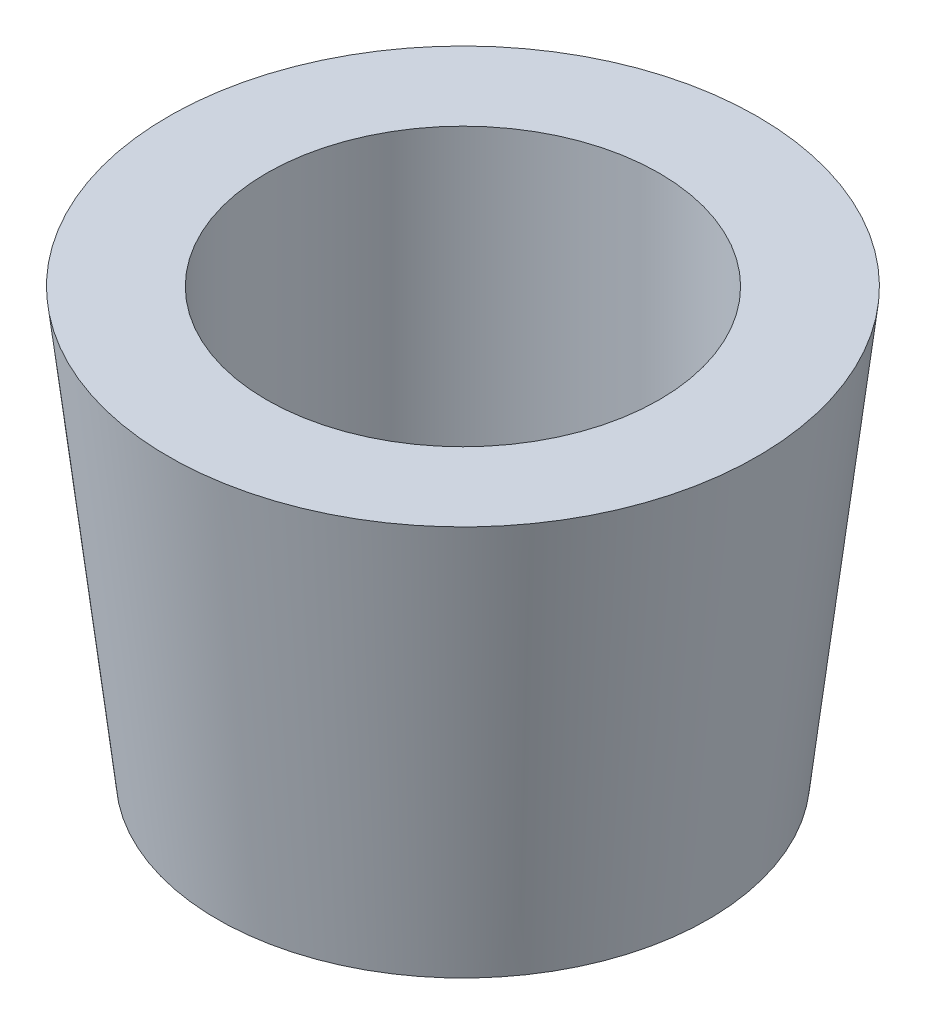
ISO-10303-21;
HEADER;
FILE_DESCRIPTION(('STEP AP214'),'2;1');
FILE_NAME('part.step','',(''),(''),'','','');
FILE_SCHEMA(('AUTOMOTIVE_DESIGN { 1 0 10303 214 1 1 1 1 }'));
ENDSEC;
DATA;
#1=APPLICATION_CONTEXT('core data for automotive mechanical design processes');
#2=APPLICATION_PROTOCOL_DEFINITION('international standard','automotive_design',2000,#1);
#3=PRODUCT_CONTEXT('',#1,'mechanical');
#4=PRODUCT('Part','Part','',(#3));
#5=PRODUCT_RELATED_PRODUCT_CATEGORY('part','',(#4));
#6=PRODUCT_DEFINITION_FORMATION('','',#4);
#7=PRODUCT_DEFINITION_CONTEXT('part definition',#1,'design');
#8=PRODUCT_DEFINITION('design','',#6,#7);
#9=PRODUCT_DEFINITION_SHAPE('','',#8);
#10=(LENGTH_UNIT() NAMED_UNIT(*) SI_UNIT(.MILLI.,.METRE.));
#11=(NAMED_UNIT(*) PLANE_ANGLE_UNIT() SI_UNIT($,.RADIAN.));
#12=(NAMED_UNIT(*) SI_UNIT($,.STERADIAN.) SOLID_ANGLE_UNIT());
#13=UNCERTAINTY_MEASURE_WITH_UNIT(LENGTH_MEASURE(1.E-05),#10,'distance_accuracy_value','');
#14=(GEOMETRIC_REPRESENTATION_CONTEXT(3) GLOBAL_UNCERTAINTY_ASSIGNED_CONTEXT((#13)) GLOBAL_UNIT_ASSIGNED_CONTEXT((#10,
#11,#12)) REPRESENTATION_CONTEXT('',''));
#15=CARTESIAN_POINT('',(0.,0.,0.));
#16=DIRECTION('',(0.,0.,1.));
#17=DIRECTION('',(1.,0.,0.));
#18=AXIS2_PLACEMENT_3D('',#15,#16,#17);
#19=CARTESIAN_POINT('',(0.,0.,0.));
#20=DIRECTION('',(0.,-1.,0.));
#21=DIRECTION('',(0.,0.,-1.));
#22=AXIS2_PLACEMENT_3D('',#19,#20,#21);
#23=CYLINDRICAL_SURFACE('',#22,3.);
#24=CARTESIAN_POINT('',(0.,-3.25,0.));
#25=DIRECTION('',(0.,-1.,0.));
#26=DIRECTION('',(0.,0.,-1.));
#27=AXIS2_PLACEMENT_3D('',#24,#25,#26);
#28=CIRCLE('',#27,3.);
#29=CARTESIAN_POINT('',(0.,-3.25,-3.));
#30=VERTEX_POINT('',#29);
#31=EDGE_CURVE('E45',#30,#30,#28,.T.);
#32=ORIENTED_EDGE('',*,*,#31,.T.);
#33=EDGE_LOOP('',(#32));
#34=FACE_BOUND('',#33,.T.);
#35=CARTESIAN_POINT('',(0.,3.25,0.));
#36=DIRECTION('',(0.,-1.,0.));
#37=DIRECTION('',(0.,0.,-1.));
#38=AXIS2_PLACEMENT_3D('',#35,#36,#37);
#39=CIRCLE('',#38,3.);
#40=CARTESIAN_POINT('',(0.,3.25,-3.));
#41=VERTEX_POINT('',#40);
#42=EDGE_CURVE('E10',#41,#41,#39,.T.);
#43=ORIENTED_EDGE('',*,*,#42,.F.);
#44=EDGE_LOOP('',(#43));
#45=FACE_BOUND('',#44,.T.);
#46=ADVANCED_FACE('F31',(#34,#45),#23,.F.);
#47=CARTESIAN_POINT('',(3.,3.25,0.));
#48=DIRECTION('',(0.,1.,0.));
#49=DIRECTION('',(0.,0.,1.));
#50=AXIS2_PLACEMENT_3D('',#47,#48,#49);
#51=PLANE('',#50);
#52=ORIENTED_EDGE('',*,*,#42,.T.);
#53=EDGE_LOOP('',(#52));
#54=FACE_BOUND('',#53,.T.);
#55=CARTESIAN_POINT('',(0.,3.25,0.));
#56=DIRECTION('',(0.,-1.,0.));
#57=DIRECTION('',(0.,0.,-1.));
#58=AXIS2_PLACEMENT_3D('',#55,#56,#57);
#59=CIRCLE('',#58,4.5);
#60=CARTESIAN_POINT('',(0.,3.25,-4.5));
#61=VERTEX_POINT('',#60);
#62=EDGE_CURVE('E37',#61,#61,#59,.T.);
#63=ORIENTED_EDGE('',*,*,#62,.F.);
#64=EDGE_LOOP('',(#63));
#65=FACE_BOUND('',#64,.T.);
#66=ADVANCED_FACE('F61',(#54,#65),#51,.T.);
#67=CARTESIAN_POINT('',(0.,-3.25,0.));
#68=DIRECTION('',(0.,1.,0.));
#69=DIRECTION('',(0.,0.,1.));
#70=AXIS2_PLACEMENT_3D('',#67,#68,#69);
#71=CONICAL_SURFACE('',#70,3.75,0.114876605416899);
#72=ORIENTED_EDGE('',*,*,#62,.T.);
#73=EDGE_LOOP('',(#72));
#74=FACE_BOUND('',#73,.T.);
#75=CARTESIAN_POINT('',(0.,-3.25,0.));
#76=DIRECTION('',(0.,-1.,0.));
#77=DIRECTION('',(0.,0.,-1.));
#78=AXIS2_PLACEMENT_3D('',#75,#76,#77);
#79=CIRCLE('',#78,3.75);
#80=CARTESIAN_POINT('',(0.,-3.25,-3.75));
#81=VERTEX_POINT('',#80);
#82=EDGE_CURVE('E41',#81,#81,#79,.T.);
#83=ORIENTED_EDGE('',*,*,#82,.F.);
#84=EDGE_LOOP('',(#83));
#85=FACE_BOUND('',#84,.T.);
#86=ADVANCED_FACE('F55',(#74,#85),#71,.T.);
#87=CARTESIAN_POINT('',(3.75,-3.25,0.));
#88=DIRECTION('',(0.,-1.,0.));
#89=DIRECTION('',(0.,0.,-1.));
#90=AXIS2_PLACEMENT_3D('',#87,#88,#89);
#91=PLANE('',#90);
#92=ORIENTED_EDGE('',*,*,#82,.T.);
#93=EDGE_LOOP('',(#92));
#94=FACE_BOUND('',#93,.T.);
#95=ORIENTED_EDGE('',*,*,#31,.F.);
#96=EDGE_LOOP('',(#95));
#97=FACE_BOUND('',#96,.T.);
#98=ADVANCED_FACE('F53',(#94,#97),#91,.T.);
#99=CLOSED_SHELL('',(#46,#66,#86,#98));
#100=MANIFOLD_SOLID_BREP('B2',#99);
#101=ADVANCED_BREP_SHAPE_REPRESENTATION('',(#18,#100),#14);
#102=SHAPE_DEFINITION_REPRESENTATION(#9,#101);
ENDSEC;
END-ISO-10303-21;
